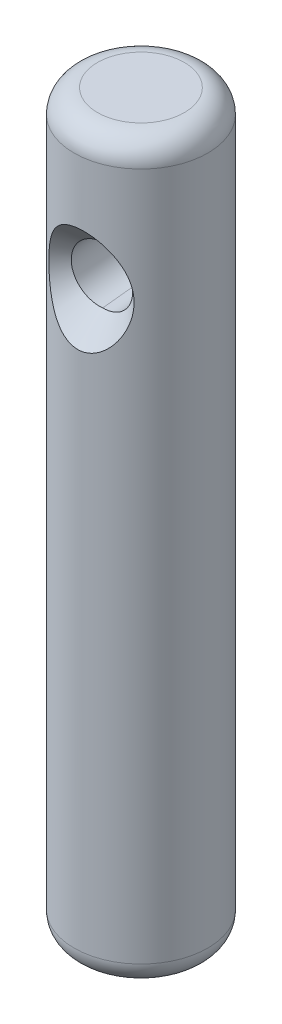
ISO-10303-21;
HEADER;
FILE_DESCRIPTION(('STEP AP214'),'2;1');
FILE_NAME('part.step','',(''),(''),'','','');
FILE_SCHEMA(('AUTOMOTIVE_DESIGN { 1 0 10303 214 1 1 1 1 }'));
ENDSEC;
DATA;
#1=APPLICATION_CONTEXT('core data for automotive mechanical design processes');
#2=APPLICATION_PROTOCOL_DEFINITION('international standard','automotive_design',2000,#1);
#3=PRODUCT_CONTEXT('',#1,'mechanical');
#4=PRODUCT('Part','Part','',(#3));
#5=PRODUCT_RELATED_PRODUCT_CATEGORY('part','',(#4));
#6=PRODUCT_DEFINITION_FORMATION('','',#4);
#7=PRODUCT_DEFINITION_CONTEXT('part definition',#1,'design');
#8=PRODUCT_DEFINITION('design','',#6,#7);
#9=PRODUCT_DEFINITION_SHAPE('','',#8);
#10=(LENGTH_UNIT() NAMED_UNIT(*) SI_UNIT(.MILLI.,.METRE.));
#11=(NAMED_UNIT(*) PLANE_ANGLE_UNIT() SI_UNIT($,.RADIAN.));
#12=(NAMED_UNIT(*) SI_UNIT($,.STERADIAN.) SOLID_ANGLE_UNIT());
#13=UNCERTAINTY_MEASURE_WITH_UNIT(LENGTH_MEASURE(1.E-05),#10,'distance_accuracy_value','');
#14=(GEOMETRIC_REPRESENTATION_CONTEXT(3) GLOBAL_UNCERTAINTY_ASSIGNED_CONTEXT((#13)) GLOBAL_UNIT_ASSIGNED_CONTEXT((#10,
#11,#12)) REPRESENTATION_CONTEXT('',''));
#15=CARTESIAN_POINT('',(0.,0.,0.));
#16=DIRECTION('',(0.,0.,1.));
#17=DIRECTION('',(1.,0.,0.));
#18=AXIS2_PLACEMENT_3D('',#15,#16,#17);
#19=CARTESIAN_POINT('',(0.,44.,0.));
#20=DIRECTION('',(0.,-1.,0.));
#21=DIRECTION('',(0.,0.,-1.));
#22=AXIS2_PLACEMENT_3D('',#19,#20,#21);
#23=CYLINDRICAL_SURFACE('',#22,4.);
#24=CARTESIAN_POINT('',(-1.50440391642833,33.6122239938578,3.70631472679342));
#25=CARTESIAN_POINT('',(-1.6123242202313,33.7716645082415,3.66251243739149));
#26=CARTESIAN_POINT('',(-1.70584553002524,33.9410082786929,3.61910739712316));
#27=CARTESIAN_POINT('',(-1.86468950679956,34.2942724263474,3.53989250503277));
#28=CARTESIAN_POINT('',(-1.92998547005813,34.4782064133925,3.50408986198183));
#29=CARTESIAN_POINT('',(-2.00648824628808,34.762087918796,3.46046889972229));
#30=CARTESIAN_POINT('',(-2.0284629278172,34.8584743414008,3.44757590931897));
#31=CARTESIAN_POINT('',(-2.06496305988747,35.053084959549,3.425841266991));
#32=CARTESIAN_POINT('',(-2.07949151354048,35.1513083976196,3.41699798194749));
#33=CARTESIAN_POINT('',(-2.10098130411045,35.348770487263,3.40382653005825));
#34=CARTESIAN_POINT('',(-2.10795076411009,35.4480079331219,3.39949351656462));
#35=CARTESIAN_POINT('',(-2.11428729134897,35.6468181292269,3.39555657943783));
#36=CARTESIAN_POINT('',(-2.11365474301841,35.7463908622631,3.39595241666879));
#37=CARTESIAN_POINT('',(-2.10499440989687,35.9405790504521,3.40132641834515));
#38=CARTESIAN_POINT('',(-2.09730151445243,36.0352155050033,3.40609706662617));
#39=CARTESIAN_POINT('',(-2.07505112301025,36.223413864296,3.41969764697859));
#40=CARTESIAN_POINT('',(-2.06049113837479,36.3169753668721,3.42852905064132));
#41=CARTESIAN_POINT('',(-2.02458686922555,36.5024565892132,3.44985285740164));
#42=CARTESIAN_POINT('',(-2.00323617761827,36.5943746715362,3.46234871707485));
#43=CARTESIAN_POINT('',(-1.95385729120712,36.7759248624159,3.49045009166377));
#44=CARTESIAN_POINT('',(-1.92582652442312,36.8655560757246,3.50605680394857));
#45=CARTESIAN_POINT('',(-1.83078040839172,37.1332181302949,3.55717935515261));
#46=CARTESIAN_POINT('',(-1.75339955561907,37.3069507256238,3.59661132007142));
#47=CARTESIAN_POINT('',(-1.57139001573936,37.6382870787493,3.67977338115581));
#48=CARTESIAN_POINT('',(-1.46678750879005,37.7959061318219,3.72349932261));
#49=CARTESIAN_POINT('',(-1.26312507313639,38.0473856744638,3.79639904895169));
#50=CARTESIAN_POINT('',(-1.17093898280228,38.1466353543952,3.82617676469368));
#51=CARTESIAN_POINT('',(-0.971738269015752,38.3303315754475,3.8815423732005));
#52=CARTESIAN_POINT('',(-0.864750963326687,38.4148047528361,3.90713779939503));
#53=CARTESIAN_POINT('',(-0.662696524841054,38.5469588800155,3.94573586034228));
#54=CARTESIAN_POINT('',(-0.570552794853655,38.5986331095694,3.96028095737449));
#55=CARTESIAN_POINT('',(-0.378780592441196,38.687590327955,3.98319222254574));
#56=CARTESIAN_POINT('',(-0.279157653117243,38.7248838326867,3.99156290982433));
#57=CARTESIAN_POINT('',(-0.0737226818772155,38.7825599613628,4.00065054130201));
#58=CARTESIAN_POINT('',(0.0321364360056717,38.8027895453767,4.00129889103154));
#59=CARTESIAN_POINT('',(0.245457124676505,38.8237755038314,3.99388352538699));
#60=CARTESIAN_POINT('',(0.352917398735846,38.8245468614862,3.9858265182936));
#61=CARTESIAN_POINT('',(0.550655321296577,38.8078277632496,3.96299455219891));
#62=CARTESIAN_POINT('',(0.641279771940234,38.7928103112298,3.9492840658816));
#63=CARTESIAN_POINT('',(0.818212469082264,38.7493855739522,3.91645699306802));
#64=CARTESIAN_POINT('',(0.90451899635873,38.7209730014998,3.89733827307808));
#65=CARTESIAN_POINT('',(1.09460294907098,38.6428608978782,3.84889260374772));
#66=CARTESIAN_POINT('',(1.19649270587802,38.5894262917608,3.81820647233182));
#67=CARTESIAN_POINT('',(1.38910814707311,38.4673170992998,3.75243870716282));
#68=CARTESIAN_POINT('',(1.47981187383627,38.3986132579426,3.71734869275992));
#69=CARTESIAN_POINT('',(1.6816195171822,38.2213957745024,3.63156623037352));
#70=CARTESIAN_POINT('',(1.78767185418076,38.1076018158964,3.57994537181595));
#71=CARTESIAN_POINT('',(1.97941585368428,37.8637450956961,3.47760733861207));
#72=CARTESIAN_POINT('',(2.06508038987957,37.7336610069363,3.42689145006999));
#73=CARTESIAN_POINT('',(2.21965159822759,37.4570744709708,3.32892664851642));
#74=CARTESIAN_POINT('',(2.28797571286586,37.3101954799497,3.28182819912707));
#75=CARTESIAN_POINT('',(2.40528604145048,37.0063780636678,3.19685176671385));
#76=CARTESIAN_POINT('',(2.45427549992345,36.8494413313273,3.15897223708288));
#77=CARTESIAN_POINT('',(2.5171812915785,36.5933809884872,3.10880714124376));
#78=CARTESIAN_POINT('',(2.53727024269585,36.4965316626995,3.09236533763063));
#79=CARTESIAN_POINT('',(2.5706442517919,36.3009447995892,3.06468018090993));
#80=CARTESIAN_POINT('',(2.58393148667864,36.2022078769056,3.05343516466837));
#81=CARTESIAN_POINT('',(2.60366335914502,36.0035978050252,3.0366272090438));
#82=CARTESIAN_POINT('',(2.610109659025,35.9037249378196,3.03106288930295));
#83=CARTESIAN_POINT('',(2.61613731432319,35.7036218254593,3.02586228587852));
#84=CARTESIAN_POINT('',(2.61571920577874,35.603391608821,3.02622553931445));
#85=CARTESIAN_POINT('',(2.60821681364945,35.4084692041288,3.03269290790678));
#86=CARTESIAN_POINT('',(2.60147159030347,35.3137538859801,3.03850501866008));
#87=CARTESIAN_POINT('',(2.58182166704013,35.1253871735093,3.05521888483705));
#88=CARTESIAN_POINT('',(2.5689147572593,35.0317361732473,3.06612246626501));
#89=CARTESIAN_POINT('',(2.53696258024102,34.8460878162168,3.09261251870798));
#90=CARTESIAN_POINT('',(2.51791285205676,34.7540917126601,3.10820239237332));
#91=CARTESIAN_POINT('',(2.47369452015377,34.572378082865,3.14350584118406));
#92=CARTESIAN_POINT('',(2.44852355927523,34.4826614491379,3.1632210044838));
#93=CARTESIAN_POINT('',(2.36290331294505,34.214884889009,3.2283014828252));
#94=CARTESIAN_POINT('',(2.29283711219372,34.041104168529,3.2791562975379));
#95=CARTESIAN_POINT('',(2.12648620765208,33.7096082042304,3.38939537487964));
#96=CARTESIAN_POINT('',(2.03022513202153,33.5518786573415,3.44877192807481));
#97=CARTESIAN_POINT('',(1.84068639667735,33.2998873804847,3.55246489110305));
#98=CARTESIAN_POINT('',(1.75424879919846,33.2002841161297,3.59629694057152));
#99=CARTESIAN_POINT('',(1.56601964044895,33.0158964433414,3.6821519054254));
#100=CARTESIAN_POINT('',(1.46425647188857,32.9310852449033,3.72417798531417));
#101=CARTESIAN_POINT('',(1.27058580607638,32.7984167426013,3.79389122565269));
#102=CARTESIAN_POINT('',(1.18182881683152,32.7465485190413,3.82264853479226));
#103=CARTESIAN_POINT('',(0.995929796261076,32.6572017218794,3.87523217766065));
#104=CARTESIAN_POINT('',(0.898793905420925,32.6197127183683,3.89906207965958));
#105=CARTESIAN_POINT('',(0.697174213108201,32.5616531764769,3.94012704613355));
#106=CARTESIAN_POINT('',(0.592632541081244,32.541236708934,3.95730131864107));
#107=CARTESIAN_POINT('',(0.380575143171717,32.5199100376228,3.98328221555135));
#108=CARTESIAN_POINT('',(0.273061871089913,32.5189841944839,3.99209554339266));
#109=CARTESIAN_POINT('',(0.0740215110455686,32.5354542483453,4.00038439152661));
#110=CARTESIAN_POINT('',(-0.0176800585879581,32.550360520858,4.00097259496623));
#111=CARTESIAN_POINT('',(-0.197682911141499,32.5935856206401,3.99612805471522));
#112=CARTESIAN_POINT('',(-0.28598253209108,32.6219109159331,3.99069240580931));
#113=CARTESIAN_POINT('',(-0.48132148299632,32.6997981342888,3.9724615361172));
#114=CARTESIAN_POINT('',(-0.586718716866477,32.7530796987797,3.9580365159763));
#115=CARTESIAN_POINT('',(-0.787163006472776,32.8748672301377,3.92310865282498));
#116=CARTESIAN_POINT('',(-0.882193564082269,32.9433969518463,3.90259630965386));
#117=CARTESIAN_POINT('',(-1.07485313900978,33.1035741982328,3.85434659399778));
#118=CARTESIAN_POINT('',(-1.1707083220652,33.1971499101841,3.82598596732772));
#119=CARTESIAN_POINT('',(-1.34814994996057,33.3963043805325,3.76712624161374));
#120=CARTESIAN_POINT('',(-1.42972439082807,33.5018931149031,3.73662537342311));
#121=CARTESIAN_POINT('',(-1.50440391642833,33.6122239938578,3.70631472679342));
#122=B_SPLINE_CURVE_WITH_KNOTS('',3,(#24,#25,#26,#27,#28,#29,#30,#31,#32,#33,#34,#35,#36,#37,
#38,#39,#40,#41,#42,#43,#44,#45,#46,#47,#48,#49,#50,#51,#52,#53,#54,#55,#56,#57,#58,#59,#60,#61,
#62,#63,#64,#65,#66,#67,#68,#69,#70,#71,#72,#73,#74,#75,#76,#77,#78,#79,#80,#81,#82,#83,#84,#85,
#86,#87,#88,#89,#90,#91,#92,#93,#94,#95,#96,#97,#98,#99,#100,#101,#102,#103,#104,#105,#106,#107,
#108,#109,#110,#111,#112,#113,#114,#115,#116,#117,#118,#119,#120,#121),.UNSPECIFIED.,.T.,.F.,(4,
2,2,2,2,2,2,2,2,2,2,2,2,2,2,2,2,2,2,2,2,2,2,2,2,2,2,2,2,2,2,2,2,2,2,2,2,2,2,2,2,2,2,2,2,2,2,2,
4),(0.,0.591863185526714,1.18428510789725,1.48306030715363,1.78171491343179,2.08004825906899,
2.37836651818452,2.66322751855618,2.94819183216151,3.23342581377002,3.51876979485309,
4.09878734080749,4.67824910895536,5.09302427131604,5.50704387341239,5.82577888730982,
6.14428038234125,6.4656089119497,6.78669000475835,7.06403889418967,7.34149734791049,
7.69676170251002,8.05271268360782,8.54174412808491,9.03142264434126,9.53585238979189,
10.0401974514338,10.3406687440856,10.6410438098511,10.941345869809,11.2416244794789,
11.5266784972133,11.8118348252893,12.0971987035122,12.3826726439391,12.9624579824881,
13.541722069854,13.9573368207746,14.372190851209,14.6912472836953,15.0100718502489,
15.3317435090681,15.6531570471594,15.9305916627081,16.2081601391383,16.5631442498775,
16.9186853052401,17.3279050215106,17.7374670812699),.UNSPECIFIED.);
#123=CARTESIAN_POINT('',(-1.50440391642833,33.6122239938578,3.70631472679342));
#124=VERTEX_POINT('',#123);
#125=EDGE_CURVE('E107',#124,#124,#122,.T.);
#126=ORIENTED_EDGE('',*,*,#125,.T.);
#127=EDGE_LOOP('',(#126));
#128=FACE_BOUND('',#127,.T.);
#129=CARTESIAN_POINT('',(-1.73171546108207,33.0333214158932,-3.60571224238036));
#130=CARTESIAN_POINT('',(-1.64896133795928,32.9579311326963,-3.64545626486817));
#131=CARTESIAN_POINT('',(-1.56046912264063,32.8883955786366,-3.68445987451835));
#132=CARTESIAN_POINT('',(-1.37202734788977,32.7643815254986,-3.7586889605312));
#133=CARTESIAN_POINT('',(-1.27209404783804,32.7098820248676,-3.79391966414245));
#134=CARTESIAN_POINT('',(-1.08229138994398,32.6284781342941,-3.85181866680374));
#135=CARTESIAN_POINT('',(-0.994182683059444,32.5982824441098,-3.87559989297258));
#136=CARTESIAN_POINT('',(-0.813024943858643,32.5522004250139,-3.91760231381138));
#137=CARTESIAN_POINT('',(-0.719979872255886,32.5363028025003,-3.93582788918214));
#138=CARTESIAN_POINT('',(-0.531159424579572,32.5200246642293,-3.96573211645635));
#139=CARTESIAN_POINT('',(-0.435375927289383,32.5196964493621,-3.97738857179572));
#140=CARTESIAN_POINT('',(-0.244445420673925,32.5347184625502,-3.99367427703702));
#141=CARTESIAN_POINT('',(-0.149298573376933,32.5500725396276,-3.99830180108229));
#142=CARTESIAN_POINT('',(0.033243150171183,32.5941909919911,-4.0008573820784));
#143=CARTESIAN_POINT('',(0.12079357086048,32.6223103338422,-3.99908198927347));
#144=CARTESIAN_POINT('',(0.291026862241935,32.6899898367886,-3.9903112256681));
#145=CARTESIAN_POINT('',(0.373707725106506,32.729554677917,-3.98331371770641));
#146=CARTESIAN_POINT('',(0.570624449017375,32.8391446813239,-3.9608446636198));
#147=CARTESIAN_POINT('',(0.681477895374246,32.9147537141306,-3.94293817425041));
#148=CARTESIAN_POINT('',(0.889408384230442,33.0817367720182,-3.90131555520289));
#149=CARTESIAN_POINT('',(0.986449810905824,33.1731502543092,-3.87758482102671));
#150=CARTESIAN_POINT('',(1.19943418140621,33.4034105375185,-3.81806806198938));
#151=CARTESIAN_POINT('',(1.30943624809071,33.5474246282117,-3.78103445584094));
#152=CARTESIAN_POINT('',(1.50440242498702,33.8515651289458,-3.70777799416906));
#153=CARTESIAN_POINT('',(1.58934243238248,34.0117068521383,-3.67155594987403));
#154=CARTESIAN_POINT('',(1.7357854024925,34.347472676943,-3.60467440572938));
#155=CARTESIAN_POINT('',(1.79679607746903,34.5233388132152,-3.57413792275276));
#156=CARTESIAN_POINT('',(1.86829662066191,34.7933844172034,-3.53697092045815));
#157=CARTESIAN_POINT('',(1.88879434392936,34.884441766282,-3.52602146394098));
#158=CARTESIAN_POINT('',(1.92301815392161,35.0681458457257,-3.50747592200732));
#159=CARTESIAN_POINT('',(1.93674682475077,35.1607919555785,-3.4998785570373));
#160=CARTESIAN_POINT('',(1.9578440359758,35.3517547019779,-3.48812276213157));
#161=CARTESIAN_POINT('',(1.96485852301225,35.4501224434874,-3.48415620905215));
#162=CARTESIAN_POINT('',(1.97123258141892,35.6471884933365,-3.48055389413945));
#163=CARTESIAN_POINT('',(1.97059189496684,35.7458868126978,-3.4809182781699));
#164=CARTESIAN_POINT('',(1.96165956954846,35.9428309859572,-3.48596039307809));
#165=CARTESIAN_POINT('',(1.95336777787343,36.0410768307848,-3.49063821004781));
#166=CARTESIAN_POINT('',(1.92922336987999,36.2363297954252,-3.50403733508499));
#167=CARTESIAN_POINT('',(1.91337084497031,36.3333369301992,-3.51275859426749));
#168=CARTESIAN_POINT('',(1.85653162254644,36.6122711237345,-3.54332378007344));
#169=CARTESIAN_POINT('',(1.80577501115724,36.7917816098255,-3.56990611787663));
#170=CARTESIAN_POINT('',(1.67808356726926,37.1400610160185,-3.63167213177288));
#171=CARTESIAN_POINT('',(1.6010936944064,37.3088064588019,-3.6668738482464));
#172=CARTESIAN_POINT('',(1.46313559309026,37.555978191747,-3.7231583588464));
#173=CARTESIAN_POINT('',(1.41139808482841,37.6398755458379,-3.74318368482957));
#174=CARTESIAN_POINT('',(1.30044391395599,37.802574518181,-3.78316423309901));
#175=CARTESIAN_POINT('',(1.24122486334097,37.8813744972253,-3.80311943090182));
#176=CARTESIAN_POINT('',(1.05248794279031,38.1082325586148,-3.86128990002446));
#177=CARTESIAN_POINT('',(0.911385621879011,38.2476782939937,-3.89803777811874));
#178=CARTESIAN_POINT('',(0.668725811204987,38.4365849322314,-3.94468566977243));
#179=CARTESIAN_POINT('',(0.577597568766172,38.4984415875189,-3.95925017706677));
#180=CARTESIAN_POINT('',(0.386613085626857,38.6084276237671,-3.98243087047484));
#181=CARTESIAN_POINT('',(0.286764275251218,38.6565685449207,-3.9910520659168));
#182=CARTESIAN_POINT('',(0.0789396889105833,38.7363294226191,-4.00058489429467));
#183=CARTESIAN_POINT('',(-0.0291120371608396,38.767765851325,-4.00141248937898));
#184=CARTESIAN_POINT('',(-0.24883087206483,38.8102959239677,-3.99375779557347));
#185=CARTESIAN_POINT('',(-0.360493259504491,38.821415121068,-3.98528722257774));
#186=CARTESIAN_POINT('',(-0.566340610891336,38.8221052103315,-3.96085877468224));
#187=CARTESIAN_POINT('',(-0.660681098095506,38.8146043158991,-3.94618505814191));
#188=CARTESIAN_POINT('',(-0.84574475545342,38.7846283459141,-3.91070243944229));
#189=CARTESIAN_POINT('',(-0.936467141284401,38.7621500420967,-3.88989221514542));
#190=CARTESIAN_POINT('',(-1.11018583440072,38.7044858679517,-3.8438788328459));
#191=CARTESIAN_POINT('',(-1.19330716426854,38.6695866508056,-3.8187809224419));
#192=CARTESIAN_POINT('',(-1.35287852877864,38.5889505297114,-3.76521132610112));
#193=CARTESIAN_POINT('',(-1.42932596318593,38.5432094271838,-3.73673833528677));
#194=CARTESIAN_POINT('',(-1.61510189277123,38.4151769965758,-3.66145877917596));
#195=CARTESIAN_POINT('',(-1.71949523124297,38.3265914492775,-3.61315508500645));
#196=CARTESIAN_POINT('',(-1.91160577437141,38.1333562638101,-3.51531640381361));
#197=CARTESIAN_POINT('',(-1.99927560493662,38.0286624647486,-3.46577835552991));
#198=CARTESIAN_POINT('',(-2.1851439075782,37.7706664065739,-3.35269511975388));
#199=CARTESIAN_POINT('',(-2.27731993176396,37.6127027931123,-3.28990240976767));
#200=CARTESIAN_POINT('',(-2.43611117068201,37.2811079766857,-3.17411857190197));
#201=CARTESIAN_POINT('',(-2.50271321092987,37.1074687551356,-3.12113250319225));
#202=CARTESIAN_POINT('',(-2.58455592671905,36.8375763208494,-3.05308466486346));
#203=CARTESIAN_POINT('',(-2.60892129406228,36.7454329141709,-3.03221333055392));
#204=CARTESIAN_POINT('',(-2.65141443714399,36.5588118532074,-2.99513003040582));
#205=CARTESIAN_POINT('',(-2.66954465429373,36.4643351281141,-2.97891624128748));
#206=CARTESIAN_POINT('',(-2.69955958508058,36.2737518211847,-2.95174305325777));
#207=CARTESIAN_POINT('',(-2.7114507176342,36.1776470198839,-2.9407782550834));
#208=CARTESIAN_POINT('',(-2.72899664662853,35.9843928676343,-2.92450370562314));
#209=CARTESIAN_POINT('',(-2.73465169028447,35.8872435582468,-2.91919373016526));
#210=CARTESIAN_POINT('',(-2.73969206948366,35.6933188268986,-2.91446381880874));
#211=CARTESIAN_POINT('',(-2.7391209603077,35.5965455391958,-2.91500296503553));
#212=CARTESIAN_POINT('',(-2.73181607871769,35.4034380477874,-2.92184960442996));
#213=CARTESIAN_POINT('',(-2.72508220239102,35.3071038515129,-2.9281571948614));
#214=CARTESIAN_POINT('',(-2.70545987472614,35.1155053642101,-2.94629705639882));
#215=CARTESIAN_POINT('',(-2.69256621717881,35.0202420481241,-2.95813400069229));
#216=CARTESIAN_POINT('',(-2.66063905297226,34.8315147076818,-2.98688015678365));
#217=CARTESIAN_POINT('',(-2.64160316407034,34.7380513963796,-3.00379133642712));
#218=CARTESIAN_POINT('',(-2.57609281514116,34.4646727300868,-3.06057122660426));
#219=CARTESIAN_POINT('',(-2.52083955071786,34.288090162171,-3.10687426093438));
#220=CARTESIAN_POINT('',(-2.38609918979255,33.9484113768524,-3.21150782872754));
#221=CARTESIAN_POINT('',(-2.3066318243211,33.785304315884,-3.26982855700826));
#222=CARTESIAN_POINT('',(-2.14780362215018,33.520504422271,-3.37539442393567));
#223=CARTESIAN_POINT('',(-2.07470196950647,33.4144430062134,-3.42113977517884));
#224=CARTESIAN_POINT('',(-1.91415228044505,33.21412874156,-3.51348651483141));
#225=CARTESIAN_POINT('',(-1.82671480814349,33.119867287062,-3.5600872506161));
#226=CARTESIAN_POINT('',(-1.73171546108207,33.0333214158932,-3.60571224238036));
#227=B_SPLINE_CURVE_WITH_KNOTS('',3,(#129,#130,#131,#132,#133,#134,#135,#136,#137,#138,#139,
#140,#141,#142,#143,#144,#145,#146,#147,#148,#149,#150,#151,#152,#153,#154,#155,#156,#157,#158,
#159,#160,#161,#162,#163,#164,#165,#166,#167,#168,#169,#170,#171,#172,#173,#174,#175,#176,#177,
#178,#179,#180,#181,#182,#183,#184,#185,#186,#187,#188,#189,#190,#191,#192,#193,#194,#195,#196,
#197,#198,#199,#200,#201,#202,#203,#204,#205,#206,#207,#208,#209,#210,#211,#212,#213,#214,#215,
#216,#217,#218,#219,#220,#221,#222,#223,#224,#225,#226),.UNSPECIFIED.,.T.,.F.,(4,2,2,2,2,2,2,2,
2,2,2,2,2,2,2,2,2,2,2,2,2,2,2,2,2,2,2,2,2,2,2,2,2,2,2,2,2,2,2,2,2,2,2,2,2,2,2,2,4),(0.,
0.356058023728728,0.71161617751711,0.998794425828458,1.28574564119215,1.57366071756249,
1.86164647606746,2.13646903089736,2.41140411913767,2.81525473182074,3.22012855012108,
3.77208990590267,4.324580379466,4.88790567487627,5.1695747895286,5.45113629280751,
5.74683866017599,6.04255098667642,6.33826921543914,6.63398386907964,7.19672483649252,
7.7606538438726,8.06201472482261,8.36347204016051,8.96318440913771,9.29543386620369,
9.62740294286895,9.9629475731334,10.2980698946741,10.5839129670172,10.8698176705606,
11.1495116775926,11.4293141751313,11.8624292436377,12.2967535832741,12.8739420838126,
13.4514275264179,13.7438544040704,14.0361666494729,14.328177564547,14.6201769031121,
14.9101348678654,15.2000977217933,15.490306085286,15.780627140633,16.3502513298605,
16.9194125925004,17.3284570190887,17.7372013631018),.UNSPECIFIED.);
#228=CARTESIAN_POINT('',(-1.73171546108207,33.0333214158932,-3.60571224238036));
#229=VERTEX_POINT('',#228);
#230=EDGE_CURVE('E100',#229,#229,#227,.T.);
#231=ORIENTED_EDGE('',*,*,#230,.T.);
#232=EDGE_LOOP('',(#231));
#233=FACE_BOUND('',#232,.T.);
#234=CARTESIAN_POINT('',(0.,1.4,0.));
#235=DIRECTION('',(0.,1.,0.));
#236=DIRECTION('',(0.,0.,1.));
#237=AXIS2_PLACEMENT_3D('',#234,#235,#236);
#238=CIRCLE('',#237,4.);
#239=CARTESIAN_POINT('',(0.,1.4,4.));
#240=VERTEX_POINT('',#239);
#241=EDGE_CURVE('E91',#240,#240,#238,.T.);
#242=ORIENTED_EDGE('',*,*,#241,.T.);
#243=EDGE_LOOP('',(#242));
#244=FACE_BOUND('',#243,.T.);
#245=CARTESIAN_POINT('',(0.,42.6,0.));
#246=DIRECTION('',(0.,1.,0.));
#247=DIRECTION('',(0.,0.,1.));
#248=AXIS2_PLACEMENT_3D('',#245,#246,#247);
#249=CIRCLE('',#248,4.);
#250=CARTESIAN_POINT('',(0.,42.6,4.));
#251=VERTEX_POINT('',#250);
#252=EDGE_CURVE('E84',#251,#251,#249,.F.);
#253=ORIENTED_EDGE('',*,*,#252,.T.);
#254=EDGE_LOOP('',(#253));
#255=FACE_BOUND('',#254,.T.);
#256=ADVANCED_FACE('F33',(#128,#233,#244,#255),#23,.T.);
#257=CARTESIAN_POINT('',(0.,44.,0.));
#258=DIRECTION('',(0.,1.,0.));
#259=DIRECTION('',(0.,0.,1.));
#260=AXIS2_PLACEMENT_3D('',#257,#258,#259);
#261=PLANE('',#260);
#262=CARTESIAN_POINT('',(0.,44.,0.));
#263=DIRECTION('',(0.,1.,0.));
#264=DIRECTION('',(0.,0.,1.));
#265=AXIS2_PLACEMENT_3D('',#262,#263,#264);
#266=CIRCLE('',#265,2.6);
#267=CARTESIAN_POINT('',(0.,44.,2.6));
#268=VERTEX_POINT('',#267);
#269=EDGE_CURVE('E97',#268,#268,#266,.T.);
#270=ORIENTED_EDGE('',*,*,#269,.T.);
#271=EDGE_LOOP('',(#270));
#272=FACE_BOUND('',#271,.T.);
#273=ADVANCED_FACE('F138',(#272),#261,.T.);
#274=CARTESIAN_POINT('',(0.,0.,0.));
#275=DIRECTION('',(0.,1.,0.));
#276=DIRECTION('',(0.,0.,1.));
#277=AXIS2_PLACEMENT_3D('',#274,#275,#276);
#278=PLANE('',#277);
#279=CARTESIAN_POINT('',(0.,0.,0.));
#280=DIRECTION('',(0.,1.,0.));
#281=DIRECTION('',(0.,0.,1.));
#282=AXIS2_PLACEMENT_3D('',#279,#280,#281);
#283=CIRCLE('',#282,2.6);
#284=CARTESIAN_POINT('',(0.,0.,2.6));
#285=VERTEX_POINT('',#284);
#286=EDGE_CURVE('E94',#285,#285,#283,.F.);
#287=ORIENTED_EDGE('',*,*,#286,.T.);
#288=EDGE_LOOP('',(#287));
#289=FACE_BOUND('',#288,.T.);
#290=ADVANCED_FACE('F142',(#289),#278,.F.);
#291=CARTESIAN_POINT('',(0.,1.4,0.));
#292=DIRECTION('',(0.,1.,0.));
#293=DIRECTION('',(0.,0.,1.));
#294=AXIS2_PLACEMENT_3D('',#291,#292,#293);
#295=TOROIDAL_SURFACE('',#294,2.6,1.4);
#296=ORIENTED_EDGE('',*,*,#286,.F.);
#297=EDGE_LOOP('',(#296));
#298=FACE_BOUND('',#297,.T.);
#299=ORIENTED_EDGE('',*,*,#241,.F.);
#300=EDGE_LOOP('',(#299));
#301=FACE_BOUND('',#300,.T.);
#302=ADVANCED_FACE('F147',(#298,#301),#295,.T.);
#303=CARTESIAN_POINT('',(0.,42.6,0.));
#304=DIRECTION('',(0.,1.,0.));
#305=DIRECTION('',(0.,0.,1.));
#306=AXIS2_PLACEMENT_3D('',#303,#304,#305);
#307=TOROIDAL_SURFACE('',#306,2.6,1.4);
#308=ORIENTED_EDGE('',*,*,#252,.F.);
#309=EDGE_LOOP('',(#308));
#310=FACE_BOUND('',#309,.T.);
#311=ORIENTED_EDGE('',*,*,#269,.F.);
#312=EDGE_LOOP('',(#311));
#313=FACE_BOUND('',#312,.T.);
#314=ADVANCED_FACE('F35',(#310,#313),#307,.T.);
#315=CARTESIAN_POINT('',(-0.477245612799788,35.6717967697245,-3.9714275298768));
#316=DIRECTION('',(-0.119311403199948,0.,-0.9928568824692));
#317=DIRECTION('',(-0.9928568824692,0.,0.119311403199948));
#318=AXIS2_PLACEMENT_3D('',#315,#316,#317);
#319=CYLINDRICAL_SURFACE('',#318,1.7);
#320=CARTESIAN_POINT('',(0.,35.6717967697245,-1.79977560632594E-13));
#321=DIRECTION('',(-0.995123488158671,0.,0.0986369267309098));
#322=DIRECTION('',(-0.0986369267309084,0.,-0.995123488158671));
#323=AXIS2_PLACEMENT_3D('',#320,#321,#322);
#324=ELLIPSE('',#323,81.7416622541955,1.7);
#325=CARTESIAN_POINT('',(-0.251578576022121,37.3709690067698,-2.53811385263568));
#326=VERTEX_POINT('',#325);
#327=CARTESIAN_POINT('',(0.,37.3717967697245,-1.79977560632594E-13));
#328=VERTEX_POINT('',#327);
#329=EDGE_CURVE('E78',#326,#328,#324,.F.);
#330=ORIENTED_EDGE('',*,*,#329,.T.);
#331=CARTESIAN_POINT('',(0.,35.6717967697245,-1.79977560632594E-13));
#332=DIRECTION('',(-0.0986369267309084,0.,-0.995123488158671));
#333=DIRECTION('',(-0.995123488158671,0.,0.0986369267309098));
#334=AXIS2_PLACEMENT_3D('',#331,#332,#333);
#335=ELLIPSE('',#334,1.70036776529922,1.7);
#336=CARTESIAN_POINT('',(0.,33.9717967697245,-1.79977560632594E-13));
#337=VERTEX_POINT('',#336);
#338=EDGE_CURVE('E226',#328,#337,#335,.F.);
#339=ORIENTED_EDGE('',*,*,#338,.T.);
#340=CARTESIAN_POINT('',(-0.251578576022125,33.9726245326792,-2.53811385263568));
#341=VERTEX_POINT('',#340);
#342=EDGE_CURVE('E224',#337,#341,#324,.F.);
#343=ORIENTED_EDGE('',*,*,#342,.T.);
#344=CARTESIAN_POINT('',(-0.304244078159864,35.6717967697245,-2.53178505029646));
#345=DIRECTION('',(-0.119311403199948,0.,-0.9928568824692));
#346=DIRECTION('',(-0.9928568824692,0.,0.119311403199948));
#347=AXIS2_PLACEMENT_3D('',#344,#345,#346);
#348=CIRCLE('',#347,1.7);
#349=EDGE_CURVE('E81',#341,#326,#348,.T.);
#350=ORIENTED_EDGE('',*,*,#349,.T.);
#351=EDGE_LOOP('',(#330,#339,#343,#350));
#352=FACE_BOUND('',#351,.T.);
#353=ADVANCED_FACE('F116',(#352),#319,.F.);
#354=CARTESIAN_POINT('',(-0.477245612799788,35.6717967697245,-3.9714275298768));
#355=DIRECTION('',(-0.119311403199948,0.,-0.9928568824692));
#356=DIRECTION('',(-0.9928568824692,0.,0.119311403199948));
#357=AXIS2_PLACEMENT_3D('',#354,#355,#356);
#358=CONICAL_SURFACE('',#357,3.15,0.785398163397448);
#359=ORIENTED_EDGE('',*,*,#349,.F.);
#360=CARTESIAN_POINT('',(-1.86347068195566,35.4315263290004,-2.24423205771336));
#361=CARTESIAN_POINT('',(-1.85240813781521,35.3531873372134,-2.24623183642667));
#362=CARTESIAN_POINT('',(-1.83592573433483,35.2756338056422,-2.24921164225575));
#363=CARTESIAN_POINT('',(-1.792452649412,35.1235973224211,-2.25707448245138));
#364=CARTESIAN_POINT('',(-1.76545595187691,35.0491161557553,-2.26195860643679));
#365=CARTESIAN_POINT('',(-1.69501538237176,34.8901185670537,-2.27471006118029));
#366=CARTESIAN_POINT('',(-1.64935288703328,34.8066064588663,-2.28298031914541));
#367=CARTESIAN_POINT('',(-1.54491474081427,34.6485051831148,-2.30191389646529));
#368=CARTESIAN_POINT('',(-1.48613344490486,34.5739198780492,-2.31257824601098));
#369=CARTESIAN_POINT('',(-1.35694154122517,34.4355419540386,-2.33604331806777));
#370=CARTESIAN_POINT('',(-1.2864941261576,34.3717848311966,-2.34885080368413));
#371=CARTESIAN_POINT('',(-1.13612603002744,34.2571314595955,-2.37622293796582));
#372=CARTESIAN_POINT('',(-1.05620594838731,34.2062343977002,-2.39078747544739));
#373=CARTESIAN_POINT('',(-0.888725602952233,34.1184645638632,-2.4213509226773));
#374=CARTESIAN_POINT('',(-0.801128779218511,34.0816639448889,-2.43735670743338));
#375=CARTESIAN_POINT('',(-0.621124484421371,34.0234598947104,-2.47029474810695));
#376=CARTESIAN_POINT('',(-0.528716813235861,34.0020571045763,-2.48722704256696));
#377=CARTESIAN_POINT('',(-0.341280907756503,33.9751719364415,-2.52162191415707));
#378=CARTESIAN_POINT('',(-0.24624294254344,33.9697599286471,-2.53908649449703));
#379=CARTESIAN_POINT('',(-0.0566268348557895,33.9752022050941,-2.57398129377226));
#380=CARTESIAN_POINT('',(0.0379513010733211,33.9860567202064,-2.59141151221631));
#381=CARTESIAN_POINT('',(0.224145321449703,34.0237680389167,-2.62577311909437));
#382=CARTESIAN_POINT('',(0.315755400408381,34.0506544174525,-2.64270352476076));
#383=CARTESIAN_POINT('',(0.493218628543999,34.119711058276,-2.6755421058009));
#384=CARTESIAN_POINT('',(0.579071800722909,34.1618812594922,-2.69145028525899));
#385=CARTESIAN_POINT('',(0.742422358417524,34.2602514861224,-2.7217527230543));
#386=CARTESIAN_POINT('',(0.819933382629963,34.3164280976285,-2.73614945150906));
#387=CARTESIAN_POINT('',(0.964523917139908,34.4412758250118,-2.76303142615928));
#388=CARTESIAN_POINT('',(1.03160365630522,34.5099466666874,-2.77551671429264));
#389=CARTESIAN_POINT('',(1.15309468593237,34.6575028101826,-2.79814706155325));
#390=CARTESIAN_POINT('',(1.2075625616417,34.7363399155352,-2.80830257164904));
#391=CARTESIAN_POINT('',(1.30262782615355,34.9022382616735,-2.82603765829883));
#392=CARTESIAN_POINT('',(1.34322564951487,34.9892992446901,-2.83361731555612));
#393=CARTESIAN_POINT('',(1.40917086160433,35.1686621990955,-2.84593379185413));
#394=CARTESIAN_POINT('',(1.43460044175966,35.2609329030766,-2.85068593187102));
#395=CARTESIAN_POINT('',(1.46980574690337,35.4485143719991,-2.85726580876014));
#396=CARTESIAN_POINT('',(1.47958186702962,35.5438250601407,-2.85909361945076));
#397=CARTESIAN_POINT('',(1.48318507050963,35.7343926129566,-2.85976724177558));
#398=CARTESIAN_POINT('',(1.47707286226476,35.8296482955776,-2.85862440408921));
#399=CARTESIAN_POINT('',(1.44920801360427,36.0177608413458,-2.8534159306949));
#400=CARTESIAN_POINT('',(1.42745549126755,36.1106177225977,-2.8493503170529));
#401=CARTESIAN_POINT('',(1.36895780123323,36.2912692887319,-2.83842257358133));
#402=CARTESIAN_POINT('',(1.33221807620301,36.3790657981142,-2.83156145895109));
#403=CARTESIAN_POINT('',(1.24481393087571,36.5471660430807,-2.81525050349778));
#404=CARTESIAN_POINT('',(1.19414932925604,36.6274696810783,-2.80580062896521));
#405=CARTESIAN_POINT('',(1.08016816551533,36.778592753812,-2.7845601869099));
#406=CARTESIAN_POINT('',(1.01681110287475,36.8493805842402,-2.77276212733975));
#407=CARTESIAN_POINT('',(0.879363197828598,36.9792024441411,-2.74719449071965));
#408=CARTESIAN_POINT('',(0.805272061773835,37.0382361519544,-2.73342485973406));
#409=CARTESIAN_POINT('',(0.64803646025789,37.1432089511211,-2.70423821442436));
#410=CARTESIAN_POINT('',(0.564845957998636,37.1890767580565,-2.68881283117459));
#411=CARTESIAN_POINT('',(0.392093906762654,37.2660376335655,-2.65682295123826));
#412=CARTESIAN_POINT('',(0.302532177051499,37.2971302828157,-2.64025842223766));
#413=CARTESIAN_POINT('',(0.119102275203944,37.3438073724354,-2.60638013317936));
#414=CARTESIAN_POINT('',(0.0252149899130199,37.3593143280965,-2.58906307188315));
#415=CARTESIAN_POINT('',(-0.163797207351205,37.3741226594322,-2.55425078596859));
#416=CARTESIAN_POINT('',(-0.258922142347787,37.3734237332062,-2.53675555803722));
#417=CARTESIAN_POINT('',(-0.447949188983427,37.3558150078435,-2.50203988097483));
#418=CARTESIAN_POINT('',(-0.541847835441325,37.3388664757641,-2.4848201883437));
#419=CARTESIAN_POINT('',(-0.725517160478665,37.2891655250214,-2.45118474033135));
#420=CARTESIAN_POINT('',(-0.81528783825489,37.2564131032829,-2.43476898510656));
#421=CARTESIAN_POINT('',(-0.988035207647638,37.1760543816952,-2.40322108142111));
#422=CARTESIAN_POINT('',(-1.07101935775437,37.128464672869,-2.38808752313065));
#423=CARTESIAN_POINT('',(-1.22791227911492,37.0197458173148,-2.35950906850865));
#424=CARTESIAN_POINT('',(-1.30182139408791,36.9586171836229,-2.3460641082206));
#425=CARTESIAN_POINT('',(-1.43813877566538,36.8248147164063,-2.32129129070371));
#426=CARTESIAN_POINT('',(-1.50059254430098,36.7521887937016,-2.30995505470736));
#427=CARTESIAN_POINT('',(-1.61255350744777,36.5972545174195,-2.28964885625464));
#428=CARTESIAN_POINT('',(-1.662059511365,36.5149452744338,-2.28067911140505));
#429=CARTESIAN_POINT('',(-1.74645310535039,36.3434254386978,-2.26539701269023));
#430=CARTESIAN_POINT('',(-1.78141053384468,36.254250310053,-2.25907196263029));
#431=CARTESIAN_POINT('',(-1.83600899957723,36.0712173875523,-2.24919631186549));
#432=CARTESIAN_POINT('',(-1.85565921470451,35.9773624355988,-2.2456440486523));
#433=CARTESIAN_POINT('',(-1.87663013321859,35.807696774252,-2.24185331813792));
#434=CARTESIAN_POINT('',(-1.8809411335888,35.7322521348066,-2.24107422102087));
#435=CARTESIAN_POINT('',(-1.87962774160631,35.5814762544774,-2.24131159432931));
#436=CARTESIAN_POINT('',(-1.87400786242618,35.5061449776456,-2.24232724911456));
#437=CARTESIAN_POINT('',(-1.86347068195566,35.4315263290004,-2.24423205771336));
#438=B_SPLINE_CURVE_WITH_KNOTS('',3,(#360,#361,#362,#363,#364,#365,#366,#367,#368,#369,#370,
#371,#372,#373,#374,#375,#376,#377,#378,#379,#380,#381,#382,#383,#384,#385,#386,#387,#388,#389,
#390,#391,#392,#393,#394,#395,#396,#397,#398,#399,#400,#401,#402,#403,#404,#405,#406,#407,#408,
#409,#410,#411,#412,#413,#414,#415,#416,#417,#418,#419,#420,#421,#422,#423,#424,#425,#426,#427,
#428,#429,#430,#431,#432,#433,#434,#435,#436,#437),.UNSPECIFIED.,.T.,.F.,(4,2,2,2,2,2,2,2,2,2,2,
2,2,2,2,2,2,2,2,2,2,2,2,2,2,2,2,2,2,2,2,2,2,2,2,2,2,2,4),(0.,0.237233938864347,
0.474603818679218,0.759831217868266,1.04518158805298,1.3314500352229,1.61770037722514,
1.9053969194301,2.19310543884071,2.48207819747211,2.77105505753703,3.06056666697501,
3.35007711958791,3.63910681740462,3.92813017286479,4.21583050043531,4.503521813319,
4.78963972143737,5.07575040701178,5.36076948822269,5.64578641766197,5.93069993398667,
6.21561716048474,6.50145844415111,6.7873075489785,7.07467633498569,7.36205327611848,
7.65085195592048,7.9396560157802,8.2291501916955,8.51864442394018,8.80781609837949,
9.09697681698993,9.38496283016241,9.67297531539097,9.95958882906614,10.2460303626436,
10.4721007009589,10.6980683261098),.UNSPECIFIED.);
#439=EDGE_CURVE('E45',#341,#326,#438,.T.);
#440=ORIENTED_EDGE('',*,*,#439,.T.);
#441=EDGE_LOOP('',(#359,#440));
#442=FACE_BOUND('',#441,.T.);
#443=ORIENTED_EDGE('',*,*,#230,.F.);
#444=EDGE_LOOP('',(#443));
#445=FACE_BOUND('',#444,.T.);
#446=ADVANCED_FACE('F112',(#442,#445),#358,.F.);
#447=CARTESIAN_POINT('',(0.311679130962507,35.6717967697245,3.98783852723784));
#448=DIRECTION('',(0.0779197827406267,0.,0.99695963180946));
#449=DIRECTION('',(0.99695963180946,0.,-0.0779197827406267));
#450=AXIS2_PLACEMENT_3D('',#447,#448,#449);
#451=CONICAL_SURFACE('',#450,3.15,0.785398163397448);
#452=ORIENTED_EDGE('',*,*,#125,.F.);
#453=EDGE_LOOP('',(#452));
#454=FACE_BOUND('',#453,.T.);
#455=CARTESIAN_POINT('',(0.198695445988598,35.6717967697245,2.54224706111412));
#456=DIRECTION('',(0.0779197827406267,0.,0.99695963180946));
#457=DIRECTION('',(0.99695963180946,0.,-0.0779197827406267));
#458=AXIS2_PLACEMENT_3D('',#455,#456,#457);
#459=CIRCLE('',#458,1.7);
#460=CARTESIAN_POINT('',(0.251578576016138,37.3709690067696,2.53811385263578));
#461=VERTEX_POINT('',#460);
#462=CARTESIAN_POINT('',(0.251578576022149,33.9726245326792,2.53811385263568));
#463=VERTEX_POINT('',#462);
#464=EDGE_CURVE('E59',#461,#463,#459,.T.);
#465=ORIENTED_EDGE('',*,*,#464,.F.);
#466=CARTESIAN_POINT('',(-1.09381648926661,34.6952870876656,2.56097093876464));
#467=CARTESIAN_POINT('',(-1.04770515900182,34.6299045531944,2.56013106021854));
#468=CARTESIAN_POINT('',(-0.996965540868709,34.5677786516933,2.55921276515715));
#469=CARTESIAN_POINT('',(-0.887244626776513,34.451243370041,2.55724498326284));
#470=CARTESIAN_POINT('',(-0.828258314889177,34.39683872712,2.55619541662722));
#471=CARTESIAN_POINT('',(-0.690979652074027,34.2870471135889,2.55377785362742));
#472=CARTESIAN_POINT('',(-0.611167192219688,34.233546106521,2.55238771283405));
#473=CARTESIAN_POINT('',(-0.443708266732555,34.1406229863304,2.54951130541658));
#474=CARTESIAN_POINT('',(-0.356058562868376,34.1012067267352,2.54802499912911));
#475=CARTESIAN_POINT('',(-0.175008139457904,34.0374007434751,2.5450006959455));
#476=CARTESIAN_POINT('',(-0.0815835846833052,34.0130786031438,2.54346249862206));
#477=CARTESIAN_POINT('',(0.10800917499541,33.9804070007093,2.54039006398944));
#478=CARTESIAN_POINT('',(0.204177210470653,33.9720565544015,2.53885582644207));
#479=CARTESIAN_POINT('',(0.396903855843227,33.9715480492723,2.53583055084685));
#480=CARTESIAN_POINT('',(0.493462628023311,33.979448253451,2.53433968774104));
#481=CARTESIAN_POINT('',(0.683888961206785,34.0113405482207,2.53144664504087));
#482=CARTESIAN_POINT('',(0.777756460492308,34.0353330075415,2.53004446747941));
#483=CARTESIAN_POINT('',(0.960169931608719,34.0987624036795,2.52736171395794));
#484=CARTESIAN_POINT('',(1.04871352841796,34.1382061753048,2.52608119212361));
#485=CARTESIAN_POINT('',(1.21789579632655,34.2314437631307,2.52366968684143));
#486=CARTESIAN_POINT('',(1.29853457084215,34.2852373915624,2.52253870143717));
#487=CARTESIAN_POINT('',(1.44934688179909,34.4054872469612,2.52045065429625));
#488=CARTESIAN_POINT('',(1.51955125906518,34.4719047796629,2.51949307810636));
#489=CARTESIAN_POINT('',(1.64774236240152,34.6156396621772,2.51776341677131));
#490=CARTESIAN_POINT('',(1.7057294299786,34.6929567072181,2.51699132644123));
#491=CARTESIAN_POINT('',(1.80751324794504,34.8558632701395,2.51564737925044));
#492=CARTESIAN_POINT('',(1.85138281513188,34.941407282734,2.51507449363443));
#493=CARTESIAN_POINT('',(1.92405450560507,35.1186735263827,2.51413072579532));
#494=CARTESIAN_POINT('',(1.9528570853533,35.2103955701753,2.51375983745258));
#495=CARTESIAN_POINT('',(1.99443543537538,35.3969126720152,2.51322577430943));
#496=CARTESIAN_POINT('',(2.00729197873888,35.4916897266288,2.51306155259687));
#497=CARTESIAN_POINT('',(2.01686716361379,35.6820549293957,2.51293916657994));
#498=CARTESIAN_POINT('',(2.0135861141902,35.7776430619802,2.51298099832925));
#499=CARTESIAN_POINT('',(1.9910125772105,35.9666612877738,2.51326988754516));
#500=CARTESIAN_POINT('',(1.97176078184835,36.0600962459122,2.51351642344326));
#501=CARTESIAN_POINT('',(1.91786337400491,36.2424133380992,2.51421129018539));
#502=CARTESIAN_POINT('',(1.8832177439188,36.331295466941,2.51465962126021));
#503=CARTESIAN_POINT('',(1.79949157334093,36.502108005353,2.51575337370835));
#504=CARTESIAN_POINT('',(1.75039379394853,36.5840299613954,2.51639903049234));
#505=CARTESIAN_POINT('',(1.63919923028092,36.7385142566822,2.51787870756003));
#506=CARTESIAN_POINT('',(1.5771021849956,36.8110764079453,2.51871273162596));
#507=CARTESIAN_POINT('',(1.44138996678735,36.9451255925953,2.52056077589118));
#508=CARTESIAN_POINT('',(1.36772584443436,37.0065630541879,2.52157556361608));
#509=CARTESIAN_POINT('',(1.21117762266977,37.1162781625648,2.52376543084207));
#510=CARTESIAN_POINT('',(1.12829325171751,37.1645554216304,2.52494051506419));
#511=CARTESIAN_POINT('',(0.955170420647395,37.2468554689746,2.52743520007052));
#512=CARTESIAN_POINT('',(0.864894194712756,37.2807987974074,2.52875555658719));
#513=CARTESIAN_POINT('',(0.679939147868506,37.3331164847778,2.53150650215409));
#514=CARTESIAN_POINT('',(0.585260212957797,37.3514904403342,2.53293709405932));
#515=CARTESIAN_POINT('',(0.393770119812678,37.3722086210365,2.53587936090437));
#516=CARTESIAN_POINT('',(0.29695179243911,37.3744865935198,2.5373913451872));
#517=CARTESIAN_POINT('',(0.104304157813081,37.3627720158422,2.54044926919054));
#518=CARTESIAN_POINT('',(0.00847486058708535,37.3487793008975,2.54199520925479));
#519=CARTESIAN_POINT('',(-0.17956854015507,37.3048830003382,2.54507561905255));
#520=CARTESIAN_POINT('',(-0.271779011208439,37.2749638457897,2.54661007606982));
#521=CARTESIAN_POINT('',(-0.449850071820878,37.200029938157,2.54961509331825));
#522=CARTESIAN_POINT('',(-0.53571071173617,37.1550153048005,2.5510856540561));
#523=CARTESIAN_POINT('',(-0.698409094745731,37.0512727954744,2.55390679594786));
#524=CARTESIAN_POINT('',(-0.775268551114644,36.992578985703,2.55525766383135));
#525=CARTESIAN_POINT('',(-0.917985025639577,36.8630627210076,2.55779214693315));
#526=CARTESIAN_POINT('',(-0.983842293510685,36.7922405414332,2.55897576594741));
#527=CARTESIAN_POINT('',(-1.10235125203128,36.640831969595,2.56112322193771));
#528=CARTESIAN_POINT('',(-1.15506357200921,36.560293048428,2.56208806603998));
#529=CARTESIAN_POINT('',(-1.24614196898039,36.3914745669482,2.56376499189234));
#530=CARTESIAN_POINT('',(-1.28450873409242,36.3031953781666,2.56447708576612));
#531=CARTESIAN_POINT('',(-1.34561714763029,36.1218705134348,2.56561522136746));
#532=CARTESIAN_POINT('',(-1.36843505212941,36.0288505398458,2.56604265889338));
#533=CARTESIAN_POINT('',(-1.39808181052219,35.8402830256836,2.56659859061389));
#534=CARTESIAN_POINT('',(-1.40490901436282,35.744735225297,2.56672705395783));
#535=CARTESIAN_POINT('',(-1.40237559560506,35.5541294949006,2.56667945285046));
#536=CARTESIAN_POINT('',(-1.39306036349161,35.4590709426842,2.56650424229147));
#537=CARTESIAN_POINT('',(-1.35859935945807,35.2719065911119,2.56585850748862));
#538=CARTESIAN_POINT('',(-1.33346307706189,35.1797990565032,2.56538816026933));
#539=CARTESIAN_POINT('',(-1.27518802805252,35.0204210618773,2.56430436876369));
#540=CARTESIAN_POINT('',(-1.24494112546682,34.9520757040441,2.56374360481731));
#541=CARTESIAN_POINT('',(-1.17573895635579,34.819974499742,2.56246819627392));
#542=CARTESIAN_POINT('',(-1.13678738916943,34.7562167188002,2.56175361705059));
#543=CARTESIAN_POINT('',(-1.09381648926661,34.6952870876656,2.56097093876464));
#544=B_SPLINE_CURVE_WITH_KNOTS('',3,(#466,#467,#468,#469,#470,#471,#472,#473,#474,#475,#476,
#477,#478,#479,#480,#481,#482,#483,#484,#485,#486,#487,#488,#489,#490,#491,#492,#493,#494,#495,
#496,#497,#498,#499,#500,#501,#502,#503,#504,#505,#506,#507,#508,#509,#510,#511,#512,#513,#514,
#515,#516,#517,#518,#519,#520,#521,#522,#523,#524,#525,#526,#527,#528,#529,#530,#531,#532,#533,
#534,#535,#536,#537,#538,#539,#540,#541,#542,#543),.UNSPECIFIED.,.T.,.F.,(4,2,2,2,2,2,2,2,2,2,2,
2,2,2,2,2,2,2,2,2,2,2,2,2,2,2,2,2,2,2,2,2,2,2,2,2,2,2,4),(0.,0.239843543405552,
0.479833607912918,0.766725753995224,1.05373699225434,1.34202421187075,1.63029366613858,
1.9195984459904,2.20890985505298,2.49834938429631,2.78778512638942,3.07634760607349,
3.36490201858544,3.65194330717373,3.93897589919962,4.22454853793745,4.51011570744804,
4.79495750119459,5.07979962069525,5.36498289375883,5.65017189351952,5.93660200075233,
6.22304054572104,6.51104675030832,6.79906041651215,7.08825888857171,7.37746028955679,
7.66694492072634,7.95642725594257,8.24519623457347,8.53395865816569,8.82136348763984,
9.10875452928583,9.39472577843114,9.68072653516075,9.96592439834439,10.2509513616085,
10.4745551135516,10.6980640176938),.UNSPECIFIED.);
#545=EDGE_CURVE('E11',#463,#461,#544,.T.);
#546=ORIENTED_EDGE('',*,*,#545,.F.);
#547=EDGE_LOOP('',(#465,#546));
#548=FACE_BOUND('',#547,.T.);
#549=ADVANCED_FACE('F70',(#454,#548),#451,.F.);
#550=CARTESIAN_POINT('',(0.311679130962507,35.6717967697245,3.98783852723784));
#551=DIRECTION('',(0.0779197827406267,0.,0.99695963180946));
#552=DIRECTION('',(0.99695963180946,0.,-0.0779197827406267));
#553=AXIS2_PLACEMENT_3D('',#550,#551,#552);
#554=CYLINDRICAL_SURFACE('',#553,1.7);
#555=ORIENTED_EDGE('',*,*,#338,.F.);
#556=CARTESIAN_POINT('',(0.,35.6717967697245,-1.79977560632594E-13));
#557=DIRECTION('',(-0.995123488158671,0.,0.0986369267309098));
#558=DIRECTION('',(-0.0986369267309084,0.,-0.995123488158671));
#559=AXIS2_PLACEMENT_3D('',#556,#557,#558);
#560=ELLIPSE('',#559,81.7416622541955,1.7);
#561=EDGE_CURVE('E77',#461,#328,#560,.T.);
#562=ORIENTED_EDGE('',*,*,#561,.F.);
#563=ORIENTED_EDGE('',*,*,#464,.T.);
#564=EDGE_CURVE('E76',#337,#463,#560,.T.);
#565=ORIENTED_EDGE('',*,*,#564,.F.);
#566=EDGE_LOOP('',(#555,#562,#563,#565));
#567=FACE_BOUND('',#566,.T.);
#568=ADVANCED_FACE('F75',(#567),#554,.F.);
#569=ORIENTED_EDGE('',*,*,#329,.F.);
#570=ORIENTED_EDGE('',*,*,#439,.F.);
#571=ORIENTED_EDGE('',*,*,#342,.F.);
#572=CARTESIAN_POINT('',(0.,35.6717967697245,-1.79977560632594E-13));
#573=DIRECTION('',(-0.0986369267309084,0.,-0.995123488158671));
#574=DIRECTION('',(-0.995123488158671,0.,0.0986369267309098));
#575=AXIS2_PLACEMENT_3D('',#572,#573,#574);
#576=ELLIPSE('',#575,1.70036776529922,1.7);
#577=EDGE_CURVE('E52',#328,#337,#576,.T.);
#578=ORIENTED_EDGE('',*,*,#577,.F.);
#579=EDGE_LOOP('',(#569,#570,#571,#578));
#580=FACE_BOUND('',#579,.T.);
#581=ADVANCED_FACE('F135',(#580),#554,.F.);
#582=ORIENTED_EDGE('',*,*,#561,.T.);
#583=ORIENTED_EDGE('',*,*,#577,.T.);
#584=ORIENTED_EDGE('',*,*,#564,.T.);
#585=ORIENTED_EDGE('',*,*,#545,.T.);
#586=EDGE_LOOP('',(#582,#583,#584,#585));
#587=FACE_BOUND('',#586,.T.);
#588=ADVANCED_FACE('F80',(#587),#319,.F.);
#589=CLOSED_SHELL('',(#256,#273,#290,#302,#314,#353,#446,#549,#568,#581,#588));
#590=MANIFOLD_SOLID_BREP('B2',#589);
#591=ADVANCED_BREP_SHAPE_REPRESENTATION('',(#18,#590),#14);
#592=SHAPE_DEFINITION_REPRESENTATION(#9,#591);
ENDSEC;
END-ISO-10303-21;
